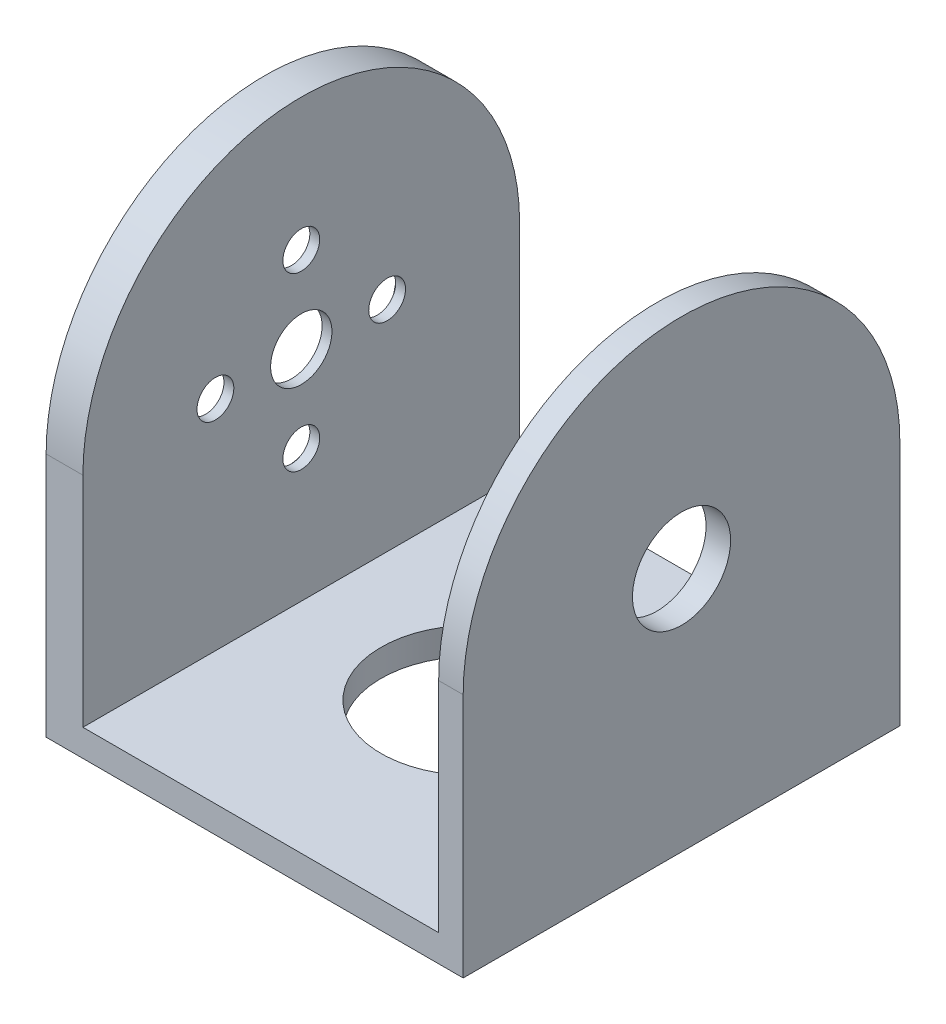
ISO-10303-21;
HEADER;
FILE_DESCRIPTION(('STEP AP214'),'2;1');
FILE_NAME('part.step','',(''),(''),'','','');
FILE_SCHEMA(('AUTOMOTIVE_DESIGN { 1 0 10303 214 1 1 1 1 }'));
ENDSEC;
DATA;
#1=APPLICATION_CONTEXT('core data for automotive mechanical design processes');
#2=APPLICATION_PROTOCOL_DEFINITION('international standard','automotive_design',2000,#1);
#3=PRODUCT_CONTEXT('',#1,'mechanical');
#4=PRODUCT('Part','Part','',(#3));
#5=PRODUCT_RELATED_PRODUCT_CATEGORY('part','',(#4));
#6=PRODUCT_DEFINITION_FORMATION('','',#4);
#7=PRODUCT_DEFINITION_CONTEXT('part definition',#1,'design');
#8=PRODUCT_DEFINITION('design','',#6,#7);
#9=PRODUCT_DEFINITION_SHAPE('','',#8);
#10=(LENGTH_UNIT() NAMED_UNIT(*) SI_UNIT(.MILLI.,.METRE.));
#11=(NAMED_UNIT(*) PLANE_ANGLE_UNIT() SI_UNIT($,.RADIAN.));
#12=(NAMED_UNIT(*) SI_UNIT($,.STERADIAN.) SOLID_ANGLE_UNIT());
#13=UNCERTAINTY_MEASURE_WITH_UNIT(LENGTH_MEASURE(1.E-05),#10,'distance_accuracy_value','');
#14=(GEOMETRIC_REPRESENTATION_CONTEXT(3) GLOBAL_UNCERTAINTY_ASSIGNED_CONTEXT((#13)) GLOBAL_UNIT_ASSIGNED_CONTEXT((#10,
#11,#12)) REPRESENTATION_CONTEXT('',''));
#15=CARTESIAN_POINT('',(0.,0.,0.));
#16=DIRECTION('',(0.,0.,1.));
#17=DIRECTION('',(1.,0.,0.));
#18=AXIS2_PLACEMENT_3D('',#15,#16,#17);
#19=CARTESIAN_POINT('',(-4.99999999999999,20.,0.));
#20=DIRECTION('',(-1.,0.,0.));
#21=DIRECTION('',(0.,0.,1.));
#22=AXIS2_PLACEMENT_3D('',#19,#20,#21);
#23=CYLINDRICAL_SURFACE('',#22,2.5);
#24=CARTESIAN_POINT('',(-14.,20.,0.));
#25=DIRECTION('',(-1.,0.,0.));
#26=DIRECTION('',(0.,0.,1.));
#27=AXIS2_PLACEMENT_3D('',#24,#25,#26);
#28=CIRCLE('',#27,2.5);
#29=CARTESIAN_POINT('',(-14.,20.,2.5));
#30=VERTEX_POINT('',#29);
#31=EDGE_CURVE('E204',#30,#30,#28,.T.);
#32=ORIENTED_EDGE('',*,*,#31,.F.);
#33=EDGE_LOOP('',(#32));
#34=FACE_BOUND('',#33,.T.);
#35=CARTESIAN_POINT('',(-14.8,20.,0.));
#36=DIRECTION('',(-1.,0.,0.));
#37=DIRECTION('',(0.,0.,1.));
#38=AXIS2_PLACEMENT_3D('',#35,#36,#37);
#39=CIRCLE('',#38,2.5);
#40=CARTESIAN_POINT('',(-14.8,20.,2.5));
#41=VERTEX_POINT('',#40);
#42=EDGE_CURVE('E226',#41,#41,#39,.T.);
#43=ORIENTED_EDGE('',*,*,#42,.T.);
#44=EDGE_LOOP('',(#43));
#45=FACE_BOUND('',#44,.T.);
#46=ADVANCED_FACE('F44',(#34,#45),#23,.F.);
#47=CARTESIAN_POINT('',(-4.99999999999999,13.,0.));
#48=DIRECTION('',(-1.,0.,0.));
#49=DIRECTION('',(0.,0.,1.));
#50=AXIS2_PLACEMENT_3D('',#47,#48,#49);
#51=CYLINDRICAL_SURFACE('',#50,1.5);
#52=CARTESIAN_POINT('',(-14.,13.,0.));
#53=DIRECTION('',(-1.,0.,0.));
#54=DIRECTION('',(0.,0.,1.));
#55=AXIS2_PLACEMENT_3D('',#52,#53,#54);
#56=CIRCLE('',#55,1.5);
#57=CARTESIAN_POINT('',(-14.,13.,1.5));
#58=VERTEX_POINT('',#57);
#59=EDGE_CURVE('E208',#58,#58,#56,.T.);
#60=ORIENTED_EDGE('',*,*,#59,.F.);
#61=EDGE_LOOP('',(#60));
#62=FACE_BOUND('',#61,.T.);
#63=CARTESIAN_POINT('',(-14.8,13.,0.));
#64=DIRECTION('',(-1.,0.,0.));
#65=DIRECTION('',(0.,0.,1.));
#66=AXIS2_PLACEMENT_3D('',#63,#64,#65);
#67=CIRCLE('',#66,1.5);
#68=CARTESIAN_POINT('',(-14.8,13.,1.5));
#69=VERTEX_POINT('',#68);
#70=EDGE_CURVE('E251',#69,#69,#67,.T.);
#71=ORIENTED_EDGE('',*,*,#70,.T.);
#72=EDGE_LOOP('',(#71));
#73=FACE_BOUND('',#72,.T.);
#74=ADVANCED_FACE('F302',(#62,#73),#51,.F.);
#75=CARTESIAN_POINT('',(-4.99999999999999,20.,-7.));
#76=DIRECTION('',(-1.,0.,0.));
#77=DIRECTION('',(0.,0.,1.));
#78=AXIS2_PLACEMENT_3D('',#75,#76,#77);
#79=CYLINDRICAL_SURFACE('',#78,1.5);
#80=CARTESIAN_POINT('',(-14.,20.,-7.));
#81=DIRECTION('',(-1.,0.,0.));
#82=DIRECTION('',(0.,0.,1.));
#83=AXIS2_PLACEMENT_3D('',#80,#81,#82);
#84=CIRCLE('',#83,1.5);
#85=CARTESIAN_POINT('',(-14.,20.,-5.5));
#86=VERTEX_POINT('',#85);
#87=EDGE_CURVE('E213',#86,#86,#84,.T.);
#88=ORIENTED_EDGE('',*,*,#87,.F.);
#89=EDGE_LOOP('',(#88));
#90=FACE_BOUND('',#89,.T.);
#91=CARTESIAN_POINT('',(-14.8,20.,-7.));
#92=DIRECTION('',(-1.,0.,0.));
#93=DIRECTION('',(0.,0.,1.));
#94=AXIS2_PLACEMENT_3D('',#91,#92,#93);
#95=CIRCLE('',#94,1.5);
#96=CARTESIAN_POINT('',(-14.8,20.,-5.5));
#97=VERTEX_POINT('',#96);
#98=EDGE_CURVE('E247',#97,#97,#95,.T.);
#99=ORIENTED_EDGE('',*,*,#98,.T.);
#100=EDGE_LOOP('',(#99));
#101=FACE_BOUND('',#100,.T.);
#102=ADVANCED_FACE('F308',(#90,#101),#79,.F.);
#103=CARTESIAN_POINT('',(-4.99999999999999,27.,0.));
#104=DIRECTION('',(-1.,0.,0.));
#105=DIRECTION('',(0.,0.,1.));
#106=AXIS2_PLACEMENT_3D('',#103,#104,#105);
#107=CYLINDRICAL_SURFACE('',#106,1.5);
#108=CARTESIAN_POINT('',(-14.,27.,0.));
#109=DIRECTION('',(-1.,0.,0.));
#110=DIRECTION('',(0.,0.,1.));
#111=AXIS2_PLACEMENT_3D('',#108,#109,#110);
#112=CIRCLE('',#111,1.5);
#113=CARTESIAN_POINT('',(-14.,27.,1.5));
#114=VERTEX_POINT('',#113);
#115=EDGE_CURVE('E217',#114,#114,#112,.T.);
#116=ORIENTED_EDGE('',*,*,#115,.F.);
#117=EDGE_LOOP('',(#116));
#118=FACE_BOUND('',#117,.T.);
#119=CARTESIAN_POINT('',(-14.8,27.,0.));
#120=DIRECTION('',(-1.,0.,0.));
#121=DIRECTION('',(0.,0.,1.));
#122=AXIS2_PLACEMENT_3D('',#119,#120,#121);
#123=CIRCLE('',#122,1.5);
#124=CARTESIAN_POINT('',(-14.8,27.,1.5));
#125=VERTEX_POINT('',#124);
#126=EDGE_CURVE('E255',#125,#125,#123,.T.);
#127=ORIENTED_EDGE('',*,*,#126,.T.);
#128=EDGE_LOOP('',(#127));
#129=FACE_BOUND('',#128,.T.);
#130=ADVANCED_FACE('F315',(#118,#129),#107,.F.);
#131=CARTESIAN_POINT('',(-4.99999999999999,20.,7.));
#132=DIRECTION('',(-1.,0.,0.));
#133=DIRECTION('',(0.,0.,1.));
#134=AXIS2_PLACEMENT_3D('',#131,#132,#133);
#135=CYLINDRICAL_SURFACE('',#134,1.5);
#136=CARTESIAN_POINT('',(-14.,20.,7.));
#137=DIRECTION('',(-1.,0.,0.));
#138=DIRECTION('',(0.,0.,1.));
#139=AXIS2_PLACEMENT_3D('',#136,#137,#138);
#140=CIRCLE('',#139,1.5);
#141=CARTESIAN_POINT('',(-14.,20.,8.5));
#142=VERTEX_POINT('',#141);
#143=EDGE_CURVE('E138',#142,#142,#140,.T.);
#144=ORIENTED_EDGE('',*,*,#143,.F.);
#145=EDGE_LOOP('',(#144));
#146=FACE_BOUND('',#145,.T.);
#147=CARTESIAN_POINT('',(-14.8,20.,7.));
#148=DIRECTION('',(-1.,0.,0.));
#149=DIRECTION('',(0.,0.,1.));
#150=AXIS2_PLACEMENT_3D('',#147,#148,#149);
#151=CIRCLE('',#150,1.5);
#152=CARTESIAN_POINT('',(-14.8,20.,8.5));
#153=VERTEX_POINT('',#152);
#154=EDGE_CURVE('E233',#153,#153,#151,.T.);
#155=ORIENTED_EDGE('',*,*,#154,.T.);
#156=EDGE_LOOP('',(#155));
#157=FACE_BOUND('',#156,.T.);
#158=ADVANCED_FACE('F375',(#146,#157),#135,.F.);
#159=CARTESIAN_POINT('',(0.,2.2,0.));
#160=DIRECTION('',(0.,-1.,0.));
#161=DIRECTION('',(0.,0.,-1.));
#162=AXIS2_PLACEMENT_3D('',#159,#160,#161);
#163=PLANE('',#162);
#164=CARTESIAN_POINT('',(0.,2.2,0.));
#165=DIRECTION('',(0.,-1.,0.));
#166=DIRECTION('',(0.,0.,-1.));
#167=AXIS2_PLACEMENT_3D('',#164,#165,#166);
#168=CIRCLE('',#167,7.5);
#169=CARTESIAN_POINT('',(0.,2.2,-7.5));
#170=VERTEX_POINT('',#169);
#171=EDGE_CURVE('E236',#170,#170,#168,.T.);
#172=ORIENTED_EDGE('',*,*,#171,.T.);
#173=EDGE_LOOP('',(#172));
#174=FACE_BOUND('',#173,.T.);
#175=DIRECTION('',(1.,0.,0.));
#176=VECTOR('',#175,1.);
#177=CARTESIAN_POINT('',(-17.,2.2,17.8));
#178=LINE('',#177,#176);
#179=CARTESIAN_POINT('',(-14.,2.2,17.8));
#180=VERTEX_POINT('',#179);
#181=CARTESIAN_POINT('',(15.,2.2,17.8));
#182=VERTEX_POINT('',#181);
#183=EDGE_CURVE('E67',#180,#182,#178,.T.);
#184=ORIENTED_EDGE('',*,*,#183,.T.);
#185=DIRECTION('',(0.,0.,-1.));
#186=VECTOR('',#185,1.);
#187=CARTESIAN_POINT('',(15.,2.2,17.8));
#188=LINE('',#187,#186);
#189=CARTESIAN_POINT('',(15.,2.2,-17.8));
#190=VERTEX_POINT('',#189);
#191=EDGE_CURVE('E62',#182,#190,#188,.T.);
#192=ORIENTED_EDGE('',*,*,#191,.T.);
#193=DIRECTION('',(-1.,0.,0.));
#194=VECTOR('',#193,1.);
#195=CARTESIAN_POINT('',(-17.,2.2,-17.8));
#196=LINE('',#195,#194);
#197=CARTESIAN_POINT('',(-14.,2.2,-17.8));
#198=VERTEX_POINT('',#197);
#199=EDGE_CURVE('E134',#190,#198,#196,.T.);
#200=ORIENTED_EDGE('',*,*,#199,.T.);
#201=DIRECTION('',(0.,0.,-1.));
#202=VECTOR('',#201,1.);
#203=CARTESIAN_POINT('',(-14.,2.2,0.));
#204=LINE('',#203,#202);
#205=EDGE_CURVE('E157',#180,#198,#204,.T.);
#206=ORIENTED_EDGE('',*,*,#205,.F.);
#207=EDGE_LOOP('',(#184,#192,#200,#206));
#208=FACE_BOUND('',#207,.T.);
#209=ADVANCED_FACE('F372',(#174,#208),#163,.F.);
#210=CARTESIAN_POINT('',(17.,2.2,17.8));
#211=DIRECTION('',(-1.,0.,0.));
#212=DIRECTION('',(0.,0.,1.));
#213=AXIS2_PLACEMENT_3D('',#210,#211,#212);
#214=PLANE('',#213);
#215=CARTESIAN_POINT('',(17.,20.,0.));
#216=DIRECTION('',(1.,0.,0.));
#217=DIRECTION('',(0.,0.,-1.));
#218=AXIS2_PLACEMENT_3D('',#215,#216,#217);
#219=CIRCLE('',#218,4.);
#220=CARTESIAN_POINT('',(17.,20.,-4.));
#221=VERTEX_POINT('',#220);
#222=EDGE_CURVE('E227',#221,#221,#219,.T.);
#223=ORIENTED_EDGE('',*,*,#222,.F.);
#224=EDGE_LOOP('',(#223));
#225=FACE_BOUND('',#224,.T.);
#226=DIRECTION('',(0.,0.,-1.));
#227=VECTOR('',#226,1.);
#228=CARTESIAN_POINT('',(17.,0.,17.8));
#229=LINE('',#228,#227);
#230=CARTESIAN_POINT('',(17.,0.,17.8));
#231=VERTEX_POINT('',#230);
#232=CARTESIAN_POINT('',(17.,0.,-17.8));
#233=VERTEX_POINT('',#232);
#234=EDGE_CURVE('E173',#231,#233,#229,.T.);
#235=ORIENTED_EDGE('',*,*,#234,.T.);
#236=DIRECTION('',(0.,-1.,0.));
#237=VECTOR('',#236,1.);
#238=CARTESIAN_POINT('',(17.,2.2,-17.8));
#239=LINE('',#238,#237);
#240=CARTESIAN_POINT('',(17.,20.,-17.8));
#241=VERTEX_POINT('',#240);
#242=EDGE_CURVE('E11',#241,#233,#239,.T.);
#243=ORIENTED_EDGE('',*,*,#242,.F.);
#244=CARTESIAN_POINT('',(17.,20.,0.));
#245=DIRECTION('',(-1.,0.,0.));
#246=DIRECTION('',(0.,0.,1.));
#247=AXIS2_PLACEMENT_3D('',#244,#245,#246);
#248=CIRCLE('',#247,17.8);
#249=CARTESIAN_POINT('',(17.,20.,17.8));
#250=VERTEX_POINT('',#249);
#251=EDGE_CURVE('E127',#250,#241,#248,.T.);
#252=ORIENTED_EDGE('',*,*,#251,.F.);
#253=DIRECTION('',(0.,-1.,0.));
#254=VECTOR('',#253,1.);
#255=CARTESIAN_POINT('',(17.,2.2,17.8));
#256=LINE('',#255,#254);
#257=EDGE_CURVE('E182',#250,#231,#256,.T.);
#258=ORIENTED_EDGE('',*,*,#257,.T.);
#259=EDGE_LOOP('',(#235,#243,#252,#258));
#260=FACE_BOUND('',#259,.T.);
#261=ADVANCED_FACE('F46',(#225,#260),#214,.F.);
#262=CARTESIAN_POINT('',(-17.,2.2,-17.8));
#263=DIRECTION('',(0.,0.,1.));
#264=DIRECTION('',(1.,0.,0.));
#265=AXIS2_PLACEMENT_3D('',#262,#263,#264);
#266=PLANE('',#265);
#267=DIRECTION('',(-1.,0.,0.));
#268=VECTOR('',#267,1.);
#269=CARTESIAN_POINT('',(-17.,0.,-17.8));
#270=LINE('',#269,#268);
#271=CARTESIAN_POINT('',(-17.,0.,-17.8));
#272=VERTEX_POINT('',#271);
#273=EDGE_CURVE('E186',#233,#272,#270,.T.);
#274=ORIENTED_EDGE('',*,*,#273,.T.);
#275=DIRECTION('',(0.,-1.,0.));
#276=VECTOR('',#275,1.);
#277=CARTESIAN_POINT('',(-17.,2.2,-17.8));
#278=LINE('',#277,#276);
#279=CARTESIAN_POINT('',(-17.,20.,-17.8));
#280=VERTEX_POINT('',#279);
#281=EDGE_CURVE('E54',#280,#272,#278,.T.);
#282=ORIENTED_EDGE('',*,*,#281,.F.);
#283=DIRECTION('',(-1.,0.,0.));
#284=VECTOR('',#283,1.);
#285=CARTESIAN_POINT('',(-14.,20.,-17.8));
#286=LINE('',#285,#284);
#287=CARTESIAN_POINT('',(-14.,20.,-17.8));
#288=VERTEX_POINT('',#287);
#289=EDGE_CURVE('E165',#288,#280,#286,.T.);
#290=ORIENTED_EDGE('',*,*,#289,.F.);
#291=DIRECTION('',(0.,1.,0.));
#292=VECTOR('',#291,1.);
#293=CARTESIAN_POINT('',(-14.,0.,-17.8));
#294=LINE('',#293,#292);
#295=EDGE_CURVE('E154',#198,#288,#294,.T.);
#296=ORIENTED_EDGE('',*,*,#295,.F.);
#297=ORIENTED_EDGE('',*,*,#199,.F.);
#298=DIRECTION('',(0.,1.,0.));
#299=VECTOR('',#298,1.);
#300=CARTESIAN_POINT('',(15.,2.20000000000001,-17.8));
#301=LINE('',#300,#299);
#302=CARTESIAN_POINT('',(15.,20.,-17.8));
#303=VERTEX_POINT('',#302);
#304=EDGE_CURVE('E115',#190,#303,#301,.T.);
#305=ORIENTED_EDGE('',*,*,#304,.T.);
#306=DIRECTION('',(1.,0.,0.));
#307=VECTOR('',#306,1.);
#308=CARTESIAN_POINT('',(15.,20.,-17.8));
#309=LINE('',#308,#307);
#310=EDGE_CURVE('E124',#303,#241,#309,.T.);
#311=ORIENTED_EDGE('',*,*,#310,.T.);
#312=ORIENTED_EDGE('',*,*,#242,.T.);
#313=EDGE_LOOP('',(#274,#282,#290,#296,#297,#305,#311,#312));
#314=FACE_BOUND('',#313,.T.);
#315=ADVANCED_FACE('F132',(#314),#266,.F.);
#316=CARTESIAN_POINT('',(-17.,2.2,17.8));
#317=DIRECTION('',(1.,0.,0.));
#318=DIRECTION('',(0.,0.,-1.));
#319=AXIS2_PLACEMENT_3D('',#316,#317,#318);
#320=PLANE('',#319);
#321=CARTESIAN_POINT('',(-17.,20.,0.));
#322=DIRECTION('',(-1.,0.,0.));
#323=DIRECTION('',(0.,0.,1.));
#324=AXIS2_PLACEMENT_3D('',#321,#322,#323);
#325=CIRCLE('',#324,10.925);
#326=CARTESIAN_POINT('',(-17.,20.,10.925));
#327=VERTEX_POINT('',#326);
#328=EDGE_CURVE('E141',#327,#327,#325,.T.);
#329=ORIENTED_EDGE('',*,*,#328,.F.);
#330=EDGE_LOOP('',(#329));
#331=FACE_BOUND('',#330,.T.);
#332=DIRECTION('',(0.,0.,1.));
#333=VECTOR('',#332,1.);
#334=CARTESIAN_POINT('',(-17.,0.,17.8));
#335=LINE('',#334,#333);
#336=CARTESIAN_POINT('',(-17.,0.,17.8));
#337=VERTEX_POINT('',#336);
#338=EDGE_CURVE('E189',#272,#337,#335,.T.);
#339=ORIENTED_EDGE('',*,*,#338,.T.);
#340=DIRECTION('',(0.,-1.,0.));
#341=VECTOR('',#340,1.);
#342=CARTESIAN_POINT('',(-17.,2.2,17.8));
#343=LINE('',#342,#341);
#344=CARTESIAN_POINT('',(-17.,20.,17.8));
#345=VERTEX_POINT('',#344);
#346=EDGE_CURVE('E197',#345,#337,#343,.T.);
#347=ORIENTED_EDGE('',*,*,#346,.F.);
#348=CARTESIAN_POINT('',(-17.,20.,0.));
#349=DIRECTION('',(-1.,0.,0.));
#350=DIRECTION('',(0.,0.,1.));
#351=AXIS2_PLACEMENT_3D('',#348,#349,#350);
#352=CIRCLE('',#351,17.8);
#353=EDGE_CURVE('E149',#280,#345,#352,.F.);
#354=ORIENTED_EDGE('',*,*,#353,.F.);
#355=ORIENTED_EDGE('',*,*,#281,.T.);
#356=EDGE_LOOP('',(#339,#347,#354,#355));
#357=FACE_BOUND('',#356,.T.);
#358=ADVANCED_FACE('F268',(#331,#357),#320,.F.);
#359=CARTESIAN_POINT('',(-17.,2.2,17.8));
#360=DIRECTION('',(0.,0.,-1.));
#361=DIRECTION('',(-1.,0.,0.));
#362=AXIS2_PLACEMENT_3D('',#359,#360,#361);
#363=PLANE('',#362);
#364=DIRECTION('',(1.,0.,0.));
#365=VECTOR('',#364,1.);
#366=CARTESIAN_POINT('',(-17.,0.,17.8));
#367=LINE('',#366,#365);
#368=EDGE_CURVE('E179',#337,#231,#367,.T.);
#369=ORIENTED_EDGE('',*,*,#368,.T.);
#370=ORIENTED_EDGE('',*,*,#257,.F.);
#371=DIRECTION('',(1.,0.,0.));
#372=VECTOR('',#371,1.);
#373=CARTESIAN_POINT('',(15.,20.,17.8));
#374=LINE('',#373,#372);
#375=CARTESIAN_POINT('',(15.,20.,17.8));
#376=VERTEX_POINT('',#375);
#377=EDGE_CURVE('E130',#376,#250,#374,.T.);
#378=ORIENTED_EDGE('',*,*,#377,.F.);
#379=DIRECTION('',(0.,1.,0.));
#380=VECTOR('',#379,1.);
#381=CARTESIAN_POINT('',(15.,2.2,17.8));
#382=LINE('',#381,#380);
#383=EDGE_CURVE('E116',#182,#376,#382,.T.);
#384=ORIENTED_EDGE('',*,*,#383,.F.);
#385=ORIENTED_EDGE('',*,*,#183,.F.);
#386=DIRECTION('',(0.,1.,0.));
#387=VECTOR('',#386,1.);
#388=CARTESIAN_POINT('',(-14.,0.,17.8));
#389=LINE('',#388,#387);
#390=CARTESIAN_POINT('',(-14.,20.,17.8));
#391=VERTEX_POINT('',#390);
#392=EDGE_CURVE('E161',#180,#391,#389,.T.);
#393=ORIENTED_EDGE('',*,*,#392,.T.);
#394=DIRECTION('',(-1.,0.,0.));
#395=VECTOR('',#394,1.);
#396=CARTESIAN_POINT('',(-14.,20.,17.8));
#397=LINE('',#396,#395);
#398=EDGE_CURVE('E169',#391,#345,#397,.T.);
#399=ORIENTED_EDGE('',*,*,#398,.T.);
#400=ORIENTED_EDGE('',*,*,#346,.T.);
#401=EDGE_LOOP('',(#369,#370,#378,#384,#385,#393,#399,#400));
#402=FACE_BOUND('',#401,.T.);
#403=ADVANCED_FACE('F271',(#402),#363,.F.);
#404=CARTESIAN_POINT('',(0.,0.,0.));
#405=DIRECTION('',(0.,-1.,0.));
#406=DIRECTION('',(0.,0.,-1.));
#407=AXIS2_PLACEMENT_3D('',#404,#405,#406);
#408=PLANE('',#407);
#409=CARTESIAN_POINT('',(0.,0.,0.));
#410=DIRECTION('',(0.,-1.,0.));
#411=DIRECTION('',(0.,0.,-1.));
#412=AXIS2_PLACEMENT_3D('',#409,#410,#411);
#413=CIRCLE('',#412,7.5);
#414=CARTESIAN_POINT('',(0.,0.,-7.5));
#415=VERTEX_POINT('',#414);
#416=EDGE_CURVE('E48',#415,#415,#413,.T.);
#417=ORIENTED_EDGE('',*,*,#416,.F.);
#418=EDGE_LOOP('',(#417));
#419=FACE_BOUND('',#418,.T.);
#420=ORIENTED_EDGE('',*,*,#234,.F.);
#421=ORIENTED_EDGE('',*,*,#368,.F.);
#422=ORIENTED_EDGE('',*,*,#338,.F.);
#423=ORIENTED_EDGE('',*,*,#273,.F.);
#424=EDGE_LOOP('',(#420,#421,#422,#423));
#425=FACE_BOUND('',#424,.T.);
#426=ADVANCED_FACE('F280',(#419,#425),#408,.T.);
#427=CARTESIAN_POINT('',(-14.,20.,0.));
#428=DIRECTION('',(-1.,0.,0.));
#429=DIRECTION('',(0.,0.,1.));
#430=AXIS2_PLACEMENT_3D('',#427,#428,#429);
#431=CYLINDRICAL_SURFACE('',#430,17.8);
#432=ORIENTED_EDGE('',*,*,#353,.T.);
#433=ORIENTED_EDGE('',*,*,#398,.F.);
#434=CARTESIAN_POINT('',(-14.,20.,0.));
#435=DIRECTION('',(-1.,0.,0.));
#436=DIRECTION('',(0.,0.,1.));
#437=AXIS2_PLACEMENT_3D('',#434,#435,#436);
#438=CIRCLE('',#437,17.8);
#439=EDGE_CURVE('E151',#288,#391,#438,.F.);
#440=ORIENTED_EDGE('',*,*,#439,.F.);
#441=ORIENTED_EDGE('',*,*,#289,.T.);
#442=EDGE_LOOP('',(#432,#433,#440,#441));
#443=FACE_BOUND('',#442,.T.);
#444=ADVANCED_FACE('F288',(#443),#431,.T.);
#445=CARTESIAN_POINT('',(-14.,0.,0.));
#446=DIRECTION('',(-1.,0.,0.));
#447=DIRECTION('',(0.,0.,1.));
#448=AXIS2_PLACEMENT_3D('',#445,#446,#447);
#449=PLANE('',#448);
#450=ORIENTED_EDGE('',*,*,#143,.T.);
#451=EDGE_LOOP('',(#450));
#452=FACE_BOUND('',#451,.T.);
#453=ORIENTED_EDGE('',*,*,#115,.T.);
#454=EDGE_LOOP('',(#453));
#455=FACE_BOUND('',#454,.T.);
#456=ORIENTED_EDGE('',*,*,#87,.T.);
#457=EDGE_LOOP('',(#456));
#458=FACE_BOUND('',#457,.T.);
#459=ORIENTED_EDGE('',*,*,#59,.T.);
#460=EDGE_LOOP('',(#459));
#461=FACE_BOUND('',#460,.T.);
#462=ORIENTED_EDGE('',*,*,#31,.T.);
#463=EDGE_LOOP('',(#462));
#464=FACE_BOUND('',#463,.T.);
#465=ORIENTED_EDGE('',*,*,#439,.T.);
#466=ORIENTED_EDGE('',*,*,#392,.F.);
#467=ORIENTED_EDGE('',*,*,#205,.T.);
#468=ORIENTED_EDGE('',*,*,#295,.T.);
#469=EDGE_LOOP('',(#465,#466,#467,#468));
#470=FACE_BOUND('',#469,.T.);
#471=ADVANCED_FACE('F284',(#452,#455,#458,#461,#464,#470),#449,.F.);
#472=CARTESIAN_POINT('',(15.,20.,0.));
#473=DIRECTION('',(1.,0.,0.));
#474=DIRECTION('',(0.,0.,-1.));
#475=AXIS2_PLACEMENT_3D('',#472,#473,#474);
#476=CYLINDRICAL_SURFACE('',#475,17.8);
#477=ORIENTED_EDGE('',*,*,#251,.T.);
#478=ORIENTED_EDGE('',*,*,#310,.F.);
#479=CARTESIAN_POINT('',(15.,20.,0.));
#480=DIRECTION('',(-1.,0.,0.));
#481=DIRECTION('',(0.,0.,1.));
#482=AXIS2_PLACEMENT_3D('',#479,#480,#481);
#483=CIRCLE('',#482,17.8);
#484=EDGE_CURVE('E111',#376,#303,#483,.T.);
#485=ORIENTED_EDGE('',*,*,#484,.F.);
#486=ORIENTED_EDGE('',*,*,#377,.T.);
#487=EDGE_LOOP('',(#477,#478,#485,#486));
#488=FACE_BOUND('',#487,.T.);
#489=ADVANCED_FACE('F125',(#488),#476,.T.);
#490=CARTESIAN_POINT('',(15.,20.,0.));
#491=DIRECTION('',(-1.,0.,0.));
#492=DIRECTION('',(0.,0.,1.));
#493=AXIS2_PLACEMENT_3D('',#490,#491,#492);
#494=PLANE('',#493);
#495=CARTESIAN_POINT('',(15.,20.,0.));
#496=DIRECTION('',(-1.,0.,0.));
#497=DIRECTION('',(0.,0.,1.));
#498=AXIS2_PLACEMENT_3D('',#495,#496,#497);
#499=CIRCLE('',#498,4.);
#500=CARTESIAN_POINT('',(15.,20.,-4.));
#501=VERTEX_POINT('',#500);
#502=EDGE_CURVE('E223',#501,#501,#499,.T.);
#503=ORIENTED_EDGE('',*,*,#502,.F.);
#504=EDGE_LOOP('',(#503));
#505=FACE_BOUND('',#504,.T.);
#506=ORIENTED_EDGE('',*,*,#304,.F.);
#507=ORIENTED_EDGE('',*,*,#191,.F.);
#508=ORIENTED_EDGE('',*,*,#383,.T.);
#509=ORIENTED_EDGE('',*,*,#484,.T.);
#510=EDGE_LOOP('',(#506,#507,#508,#509));
#511=FACE_BOUND('',#510,.T.);
#512=ADVANCED_FACE('F113',(#505,#511),#494,.T.);
#513=CARTESIAN_POINT('',(-14.8,20.,0.));
#514=DIRECTION('',(-1.,0.,0.));
#515=DIRECTION('',(0.,0.,1.));
#516=AXIS2_PLACEMENT_3D('',#513,#514,#515);
#517=CYLINDRICAL_SURFACE('',#516,10.925);
#518=CARTESIAN_POINT('',(-14.8,20.,0.));
#519=DIRECTION('',(-1.,0.,0.));
#520=DIRECTION('',(0.,0.,1.));
#521=AXIS2_PLACEMENT_3D('',#518,#519,#520);
#522=CIRCLE('',#521,10.925);
#523=CARTESIAN_POINT('',(-14.8,20.,10.925));
#524=VERTEX_POINT('',#523);
#525=EDGE_CURVE('E209',#524,#524,#522,.T.);
#526=ORIENTED_EDGE('',*,*,#525,.F.);
#527=EDGE_LOOP('',(#526));
#528=FACE_BOUND('',#527,.T.);
#529=ORIENTED_EDGE('',*,*,#328,.T.);
#530=EDGE_LOOP('',(#529));
#531=FACE_BOUND('',#530,.T.);
#532=ADVANCED_FACE('F266',(#528,#531),#517,.F.);
#533=CARTESIAN_POINT('',(-14.8,20.,0.));
#534=DIRECTION('',(-1.,0.,0.));
#535=DIRECTION('',(0.,0.,1.));
#536=AXIS2_PLACEMENT_3D('',#533,#534,#535);
#537=PLANE('',#536);
#538=ORIENTED_EDGE('',*,*,#42,.F.);
#539=EDGE_LOOP('',(#538));
#540=FACE_BOUND('',#539,.T.);
#541=ORIENTED_EDGE('',*,*,#154,.F.);
#542=EDGE_LOOP('',(#541));
#543=FACE_BOUND('',#542,.T.);
#544=ORIENTED_EDGE('',*,*,#98,.F.);
#545=EDGE_LOOP('',(#544));
#546=FACE_BOUND('',#545,.T.);
#547=ORIENTED_EDGE('',*,*,#70,.F.);
#548=EDGE_LOOP('',(#547));
#549=FACE_BOUND('',#548,.T.);
#550=ORIENTED_EDGE('',*,*,#126,.F.);
#551=EDGE_LOOP('',(#550));
#552=FACE_BOUND('',#551,.T.);
#553=ORIENTED_EDGE('',*,*,#525,.T.);
#554=EDGE_LOOP('',(#553));
#555=FACE_BOUND('',#554,.T.);
#556=ADVANCED_FACE('F338',(#540,#543,#546,#549,#552,#555),#537,.T.);
#557=CARTESIAN_POINT('',(4.80000000000001,20.,0.));
#558=DIRECTION('',(1.,0.,0.));
#559=DIRECTION('',(0.,0.,-1.));
#560=AXIS2_PLACEMENT_3D('',#557,#558,#559);
#561=CYLINDRICAL_SURFACE('',#560,4.);
#562=CARTESIAN_POINT('',(15.,20.,-4.));
#563=CARTESIAN_POINT('',(15.0208333333333,20.,-4.));
#564=CARTESIAN_POINT('',(15.0416666666667,20.,-4.));
#565=CARTESIAN_POINT('',(15.0833333333333,20.,-4.));
#566=CARTESIAN_POINT('',(15.1041666666667,20.,-4.));
#567=CARTESIAN_POINT('',(15.1458333333333,20.,-4.));
#568=CARTESIAN_POINT('',(15.1666666666667,20.,-4.));
#569=CARTESIAN_POINT('',(15.2083333333333,20.,-4.));
#570=CARTESIAN_POINT('',(15.2291666666667,20.,-4.));
#571=CARTESIAN_POINT('',(15.2708333333333,20.,-4.));
#572=CARTESIAN_POINT('',(15.2916666666667,20.,-4.));
#573=CARTESIAN_POINT('',(15.3333333333333,20.,-4.));
#574=CARTESIAN_POINT('',(15.3541666666667,20.,-4.));
#575=CARTESIAN_POINT('',(15.3958333333333,20.,-4.));
#576=CARTESIAN_POINT('',(15.4166666666667,20.,-4.));
#577=CARTESIAN_POINT('',(15.4583333333333,20.,-4.));
#578=CARTESIAN_POINT('',(15.4791666666667,20.,-4.));
#579=CARTESIAN_POINT('',(15.5208333333333,20.,-4.));
#580=CARTESIAN_POINT('',(15.5416666666667,20.,-4.));
#581=CARTESIAN_POINT('',(15.5833333333333,20.,-4.));
#582=CARTESIAN_POINT('',(15.6041666666667,20.,-4.));
#583=CARTESIAN_POINT('',(15.6458333333333,20.,-4.));
#584=CARTESIAN_POINT('',(15.6666666666667,20.,-4.));
#585=CARTESIAN_POINT('',(15.7083333333333,20.,-4.));
#586=CARTESIAN_POINT('',(15.7291666666667,20.,-4.));
#587=CARTESIAN_POINT('',(15.7708333333333,20.,-4.));
#588=CARTESIAN_POINT('',(15.7916666666667,20.,-4.));
#589=CARTESIAN_POINT('',(15.8333333333333,20.,-4.));
#590=CARTESIAN_POINT('',(15.8541666666667,20.,-4.));
#591=CARTESIAN_POINT('',(15.8958333333333,20.,-4.));
#592=CARTESIAN_POINT('',(15.9166666666667,20.,-4.));
#593=CARTESIAN_POINT('',(15.9583333333333,20.,-4.));
#594=CARTESIAN_POINT('',(15.9791666666667,20.,-4.));
#595=CARTESIAN_POINT('',(16.0208333333333,20.,-4.));
#596=CARTESIAN_POINT('',(16.0416666666667,20.,-4.));
#597=CARTESIAN_POINT('',(16.0833333333333,20.,-4.));
#598=CARTESIAN_POINT('',(16.1041666666667,20.,-4.));
#599=CARTESIAN_POINT('',(16.1458333333333,20.,-4.));
#600=CARTESIAN_POINT('',(16.1666666666667,20.,-4.));
#601=CARTESIAN_POINT('',(16.2083333333333,20.,-4.));
#602=CARTESIAN_POINT('',(16.2291666666667,20.,-4.));
#603=CARTESIAN_POINT('',(16.2708333333333,20.,-4.));
#604=CARTESIAN_POINT('',(16.2916666666667,20.,-4.));
#605=CARTESIAN_POINT('',(16.3333333333333,20.,-4.));
#606=CARTESIAN_POINT('',(16.3541666666667,20.,-4.));
#607=CARTESIAN_POINT('',(16.3958333333333,20.,-4.));
#608=CARTESIAN_POINT('',(16.4166666666667,20.,-4.));
#609=CARTESIAN_POINT('',(16.4583333333333,20.,-4.));
#610=CARTESIAN_POINT('',(16.4791666666667,20.,-4.));
#611=CARTESIAN_POINT('',(16.5208333333333,20.,-4.));
#612=CARTESIAN_POINT('',(16.5416666666667,20.,-4.));
#613=CARTESIAN_POINT('',(16.5833333333333,20.,-4.));
#614=CARTESIAN_POINT('',(16.6041666666667,20.,-4.));
#615=CARTESIAN_POINT('',(16.6458333333333,20.,-4.));
#616=CARTESIAN_POINT('',(16.6666666666667,20.,-4.));
#617=CARTESIAN_POINT('',(16.7083333333333,20.,-4.));
#618=CARTESIAN_POINT('',(16.7291666666667,20.,-4.));
#619=CARTESIAN_POINT('',(16.7708333333333,20.,-4.));
#620=CARTESIAN_POINT('',(16.7916666666667,20.,-4.));
#621=CARTESIAN_POINT('',(16.8333333333333,20.,-4.));
#622=CARTESIAN_POINT('',(16.8541666666667,20.,-4.));
#623=CARTESIAN_POINT('',(16.8958333333333,20.,-4.));
#624=CARTESIAN_POINT('',(16.9166666666667,20.,-4.));
#625=CARTESIAN_POINT('',(16.9583333333333,20.,-4.));
#626=CARTESIAN_POINT('',(16.9791666666667,20.,-4.));
#627=CARTESIAN_POINT('',(17.,20.,-4.));
#628=B_SPLINE_CURVE_WITH_KNOTS('',3,(#562,#563,#564,#565,#566,#567,#568,#569,#570,#571,#572,
#573,#574,#575,#576,#577,#578,#579,#580,#581,#582,#583,#584,#585,#586,#587,#588,#589,#590,#591,
#592,#593,#594,#595,#596,#597,#598,#599,#600,#601,#602,#603,#604,#605,#606,#607,#608,#609,#610,
#611,#612,#613,#614,#615,#616,#617,#618,#619,#620,#621,#622,#623,#624,#625,#626,#627),
.UNSPECIFIED.,.F.,.F.,(4,2,2,2,2,2,2,2,2,2,2,2,2,2,2,2,2,2,2,2,2,2,2,2,2,2,2,2,2,2,2,2,4),(0.,
0.0625000000000001,0.125,0.1875,0.25,0.312499999999999,0.374999999999999,0.437499999999999,
0.499999999999999,0.562499999999999,0.624999999999997,0.687499999999997,0.749999999999997,
0.812499999999997,0.874999999999997,0.937499999999997,0.999999999999997,1.0625,1.125,1.1875,
1.25,1.3125,1.375,1.4375,1.5,1.5625,1.625,1.6875,1.74999999999999,1.81249999999999,
1.87499999999999,1.93749999999999,1.99999999999999),.UNSPECIFIED.);
#629=EDGE_CURVE('BSEAM347',#501,#221,#628,.T.);
#630=ORIENTED_EDGE('',*,*,#502,.T.);
#631=ORIENTED_EDGE('',*,*,#222,.T.);
#632=ORIENTED_EDGE('',*,*,#629,.T.);
#633=ORIENTED_EDGE('',*,*,#629,.F.);
#634=EDGE_LOOP('',(#630,#632,#631,#633));
#635=FACE_BOUND('',#634,.T.);
#636=ADVANCED_FACE('F347',(#635),#561,.F.);
#637=CARTESIAN_POINT('',(0.,37.8,0.));
#638=DIRECTION('',(0.,-1.,0.));
#639=DIRECTION('',(0.,0.,-1.));
#640=AXIS2_PLACEMENT_3D('',#637,#638,#639);
#641=CYLINDRICAL_SURFACE('',#640,7.5);
#642=ORIENTED_EDGE('',*,*,#416,.T.);
#643=EDGE_LOOP('',(#642));
#644=FACE_BOUND('',#643,.T.);
#645=ORIENTED_EDGE('',*,*,#171,.F.);
#646=EDGE_LOOP('',(#645));
#647=FACE_BOUND('',#646,.T.);
#648=ADVANCED_FACE('F354',(#644,#647),#641,.F.);
#649=CLOSED_SHELL('',(#46,#74,#102,#130,#158,#209,#261,#315,#358,#403,#426,#444,#471,#489,#512,
#532,#556,#636,#648));
#650=MANIFOLD_SOLID_BREP('B2',#649);
#651=ADVANCED_BREP_SHAPE_REPRESENTATION('',(#18,#650),#14);
#652=SHAPE_DEFINITION_REPRESENTATION(#9,#651);
ENDSEC;
END-ISO-10303-21;
